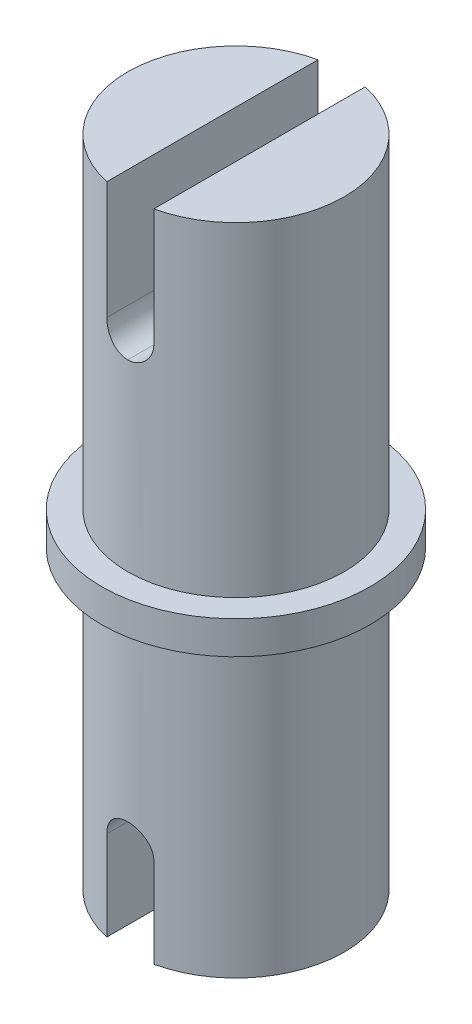
ISO-10303-21;
HEADER;
FILE_DESCRIPTION(('STEP AP214'),'2;1');
FILE_NAME('part.step','',(''),(''),'','','');
FILE_SCHEMA(('AUTOMOTIVE_DESIGN { 1 0 10303 214 1 1 1 1 }'));
ENDSEC;
DATA;
#1=APPLICATION_CONTEXT('core data for automotive mechanical design processes');
#2=APPLICATION_PROTOCOL_DEFINITION('international standard','automotive_design',2000,#1);
#3=PRODUCT_CONTEXT('',#1,'mechanical');
#4=PRODUCT('Part','Part','',(#3));
#5=PRODUCT_RELATED_PRODUCT_CATEGORY('part','',(#4));
#6=PRODUCT_DEFINITION_FORMATION('','',#4);
#7=PRODUCT_DEFINITION_CONTEXT('part definition',#1,'design');
#8=PRODUCT_DEFINITION('design','',#6,#7);
#9=PRODUCT_DEFINITION_SHAPE('','',#8);
#10=(LENGTH_UNIT() NAMED_UNIT(*) SI_UNIT(.MILLI.,.METRE.));
#11=(NAMED_UNIT(*) PLANE_ANGLE_UNIT() SI_UNIT($,.RADIAN.));
#12=(NAMED_UNIT(*) SI_UNIT($,.STERADIAN.) SOLID_ANGLE_UNIT());
#13=UNCERTAINTY_MEASURE_WITH_UNIT(LENGTH_MEASURE(1.E-05),#10,'distance_accuracy_value','');
#14=(GEOMETRIC_REPRESENTATION_CONTEXT(3) GLOBAL_UNCERTAINTY_ASSIGNED_CONTEXT((#13)) GLOBAL_UNIT_ASSIGNED_CONTEXT((#10,
#11,#12)) REPRESENTATION_CONTEXT('',''));
#15=CARTESIAN_POINT('',(0.,0.,0.));
#16=DIRECTION('',(0.,0.,1.));
#17=DIRECTION('',(1.,0.,0.));
#18=AXIS2_PLACEMENT_3D('',#15,#16,#17);
#19=CARTESIAN_POINT('',(0.,-7.25,0.));
#20=DIRECTION('',(0.,1.,0.));
#21=DIRECTION('',(0.,0.,1.));
#22=AXIS2_PLACEMENT_3D('',#19,#20,#21);
#23=CYLINDRICAL_SURFACE('',#22,2.3);
#24=CARTESIAN_POINT('',(0.,-0.35,0.));
#25=DIRECTION('',(0.,1.,0.));
#26=DIRECTION('',(0.,0.,1.));
#27=AXIS2_PLACEMENT_3D('',#24,#25,#26);
#28=CIRCLE('',#27,2.3);
#29=CARTESIAN_POINT('',(0.,-0.35,2.3));
#30=VERTEX_POINT('',#29);
#31=EDGE_CURVE('E140',#30,#30,#28,.T.);
#32=ORIENTED_EDGE('',*,*,#31,.F.);
#33=EDGE_LOOP('',(#32));
#34=FACE_BOUND('',#33,.T.);
#35=DIRECTION('',(0.,-1.,0.));
#36=VECTOR('',#35,1.);
#37=CARTESIAN_POINT('',(-0.5,-4.25,-2.24499443206436));
#38=LINE('',#37,#36);
#39=CARTESIAN_POINT('',(-0.5,-4.75,-2.24499443206436));
#40=VERTEX_POINT('',#39);
#41=CARTESIAN_POINT('',(-0.5,-6.65,-2.24499443206436));
#42=VERTEX_POINT('',#41);
#43=EDGE_CURVE('E145',#40,#42,#38,.T.);
#44=ORIENTED_EDGE('',*,*,#43,.T.);
#45=CARTESIAN_POINT('',(0.,-6.65,0.));
#46=DIRECTION('',(0.,-1.,0.));
#47=DIRECTION('',(0.,0.,-1.));
#48=AXIS2_PLACEMENT_3D('',#45,#46,#47);
#49=CIRCLE('',#48,2.3);
#50=CARTESIAN_POINT('',(-0.5,-6.65,2.24499443206436));
#51=VERTEX_POINT('',#50);
#52=EDGE_CURVE('E54',#51,#42,#49,.T.);
#53=ORIENTED_EDGE('',*,*,#52,.F.);
#54=DIRECTION('',(0.,-1.,0.));
#55=VECTOR('',#54,1.);
#56=CARTESIAN_POINT('',(-0.5,-4.25,2.24499443206436));
#57=LINE('',#56,#55);
#58=CARTESIAN_POINT('',(-0.5,-4.75,2.24499443206436));
#59=VERTEX_POINT('',#58);
#60=EDGE_CURVE('E135',#59,#51,#57,.T.);
#61=ORIENTED_EDGE('',*,*,#60,.F.);
#62=CARTESIAN_POINT('',(-0.5,-4.75,2.24499443206436));
#63=CARTESIAN_POINT('',(-0.500025434162233,-4.72222305303217,2.24497408306893));
#64=CARTESIAN_POINT('',(-0.497687024738692,-4.69446089215485,2.24550941889498));
#65=CARTESIAN_POINT('',(-0.488479736607001,-4.63978282267411,2.24753799430391));
#66=CARTESIAN_POINT('',(-0.481618918361146,-4.61286549754483,2.24902952948661));
#67=CARTESIAN_POINT('',(-0.463562205301719,-4.56058796101343,2.25281816260483));
#68=CARTESIAN_POINT('',(-0.452366042082057,-4.5352278461326,2.25511531041592));
#69=CARTESIAN_POINT('',(-0.425975724557119,-4.48673895322332,2.26024909981346));
#70=CARTESIAN_POINT('',(-0.410780831589141,-4.46361058853334,2.26308584104908));
#71=CARTESIAN_POINT('',(-0.376556030757125,-4.41986622769239,2.26903294557316));
#72=CARTESIAN_POINT('',(-0.357472606115472,-4.39929256267381,2.27214674197236));
#73=CARTESIAN_POINT('',(-0.316125030724281,-4.36160918700152,2.27826710996973));
#74=CARTESIAN_POINT('',(-0.293860280640475,-4.34450013052156,2.28127366123016));
#75=CARTESIAN_POINT('',(-0.246494096152911,-4.31406226690147,2.286878831576));
#76=CARTESIAN_POINT('',(-0.221365013380477,-4.30077559507728,2.2894727725624));
#77=CARTESIAN_POINT('',(-0.169171075301119,-4.27863678543493,2.29391915581227));
#78=CARTESIAN_POINT('',(-0.142107637943927,-4.26978143663929,2.29577213478746));
#79=CARTESIAN_POINT('',(-0.0957449499210435,-4.25887469684972,2.29808298238152));
#80=CARTESIAN_POINT('',(-0.0767480812101151,-4.25555100071087,2.29879787685876));
#81=CARTESIAN_POINT('',(-0.0385039607806533,-4.25111271905691,2.29975808776235));
#82=CARTESIAN_POINT('',(-0.0192569501805669,-4.24999614504424,2.30000382686546));
#83=CARTESIAN_POINT('',(0.,-4.25,2.3));
#84=B_SPLINE_CURVE_WITH_KNOTS('',3,(#62,#63,#64,#65,#66,#67,#68,#69,#70,#71,#72,#73,#74,#75,#76,
#77,#78,#79,#80,#81,#82,#83),.UNSPECIFIED.,.F.,.F.,(4,2,2,2,2,2,2,2,2,2,4),(0.,
0.0832049035826664,0.166261907425857,0.249324054244074,0.332401555445738,0.416710735215395,
0.501035819100043,0.586257644798393,0.671417628232312,0.729187810584911,0.786905921365021),.UNSPECIFIED.);
#85=CARTESIAN_POINT('',(0.,-4.25,2.3));
#86=VERTEX_POINT('',#85);
#87=EDGE_CURVE('E273',#59,#86,#84,.T.);
#88=ORIENTED_EDGE('',*,*,#87,.T.);
#89=CARTESIAN_POINT('',(0.,-4.25,2.3));
#90=CARTESIAN_POINT('',(0.0277845721877239,-4.24997457738012,2.30001883244396));
#91=CARTESIAN_POINT('',(0.055554983381543,-4.25231425893165,2.29949711595045));
#92=CARTESIAN_POINT('',(0.110251384694059,-4.26152739940617,2.29751368817944));
#93=CARTESIAN_POINT('',(0.137178754225612,-4.26839299770394,2.29605360676694));
#94=CARTESIAN_POINT('',(0.189477018315621,-4.28646362340849,2.29233347450605));
#95=CARTESIAN_POINT('',(0.214847765662551,-4.29766906050825,2.29007334813289));
#96=CARTESIAN_POINT('',(0.263354227827385,-4.32408105855153,2.28500291976794));
#97=CARTESIAN_POINT('',(0.286489576137246,-4.33928827409561,2.28219252778437));
#98=CARTESIAN_POINT('',(0.330226139587319,-4.37352567400049,2.27627891054117));
#99=CARTESIAN_POINT('',(0.350787156800572,-4.39260659725985,2.27317212398092));
#100=CARTESIAN_POINT('',(0.388446106930482,-4.43394393782922,2.26704088675131));
#101=CARTESIAN_POINT('',(0.405543323368396,-4.45620101049856,2.26401645322821));
#102=CARTESIAN_POINT('',(0.435968420860736,-4.50356007471157,2.25835660013056));
#103=CARTESIAN_POINT('',(0.449252090830191,-4.52869105253414,2.25572590038234));
#104=CARTESIAN_POINT('',(0.471384691828999,-4.58088876846314,2.25120519662372));
#105=CARTESIAN_POINT('',(0.480236923464258,-4.6079540486482,2.2493146415712));
#106=CARTESIAN_POINT('',(0.491135191104431,-4.65430821831344,2.24695499004473));
#107=CARTESIAN_POINT('',(0.494455085603658,-4.67329400988068,2.24622418608655));
#108=CARTESIAN_POINT('',(0.498888470507245,-4.71151667483165,2.24524200949835));
#109=CARTESIAN_POINT('',(0.500003875475348,-4.73075331572594,2.24499022085834));
#110=CARTESIAN_POINT('',(0.5,-4.75,2.24499443206436));
#111=B_SPLINE_CURVE_WITH_KNOTS('',3,(#89,#90,#91,#92,#93,#94,#95,#96,#97,#98,#99,#100,#101,#102,
#103,#104,#105,#106,#107,#108,#109,#110),.UNSPECIFIED.,.F.,.F.,(4,2,2,2,2,2,2,2,2,2,4),(0.,
0.083228954597043,0.166313736410875,0.249406363573863,0.332512591271695,0.416787149934477,
0.501079122826125,0.5863121173926,0.671481534260578,0.72921882040634,0.786905940573443),.UNSPECIFIED.);
#112=CARTESIAN_POINT('',(0.5,-4.75,2.24499443206436));
#113=VERTEX_POINT('',#112);
#114=EDGE_CURVE('E255',#86,#113,#111,.T.);
#115=ORIENTED_EDGE('',*,*,#114,.T.);
#116=DIRECTION('',(0.,-1.,0.));
#117=VECTOR('',#116,1.);
#118=CARTESIAN_POINT('',(0.5,-4.25,2.24499443206436));
#119=LINE('',#118,#117);
#120=CARTESIAN_POINT('',(0.5,-6.65,2.24499443206436));
#121=VERTEX_POINT('',#120);
#122=EDGE_CURVE('E122',#113,#121,#119,.T.);
#123=ORIENTED_EDGE('',*,*,#122,.T.);
#124=CARTESIAN_POINT('',(0.5,-6.65,-2.24499443206436));
#125=VERTEX_POINT('',#124);
#126=EDGE_CURVE('E61',#125,#121,#49,.T.);
#127=ORIENTED_EDGE('',*,*,#126,.F.);
#128=DIRECTION('',(0.,-1.,0.));
#129=VECTOR('',#128,1.);
#130=CARTESIAN_POINT('',(0.5,-4.25,-2.24499443206436));
#131=LINE('',#130,#129);
#132=CARTESIAN_POINT('',(0.5,-4.75,-2.24499443206436));
#133=VERTEX_POINT('',#132);
#134=EDGE_CURVE('E121',#133,#125,#131,.T.);
#135=ORIENTED_EDGE('',*,*,#134,.F.);
#136=CARTESIAN_POINT('',(0.5,-4.75,-2.24499443206436));
#137=CARTESIAN_POINT('',(0.500025434162233,-4.72222305303217,-2.24497408306893));
#138=CARTESIAN_POINT('',(0.497687024738692,-4.69446089215485,-2.24550941889498));
#139=CARTESIAN_POINT('',(0.488479736607001,-4.63978282267411,-2.24753799430391));
#140=CARTESIAN_POINT('',(0.481618918361146,-4.61286549754483,-2.24902952948661));
#141=CARTESIAN_POINT('',(0.463562205301719,-4.56058796101343,-2.25281816260483));
#142=CARTESIAN_POINT('',(0.452366042082057,-4.5352278461326,-2.25511531041592));
#143=CARTESIAN_POINT('',(0.425975724557119,-4.48673895322332,-2.26024909981346));
#144=CARTESIAN_POINT('',(0.410780831589141,-4.46361058853334,-2.26308584104908));
#145=CARTESIAN_POINT('',(0.376556030757125,-4.41986622769239,-2.26903294557316));
#146=CARTESIAN_POINT('',(0.357472606115472,-4.39929256267381,-2.27214674197236));
#147=CARTESIAN_POINT('',(0.316125030724281,-4.36160918700152,-2.27826710996973));
#148=CARTESIAN_POINT('',(0.293860280640475,-4.34450013052156,-2.28127366123016));
#149=CARTESIAN_POINT('',(0.246494096152911,-4.31406226690147,-2.286878831576));
#150=CARTESIAN_POINT('',(0.221365013380477,-4.30077559507728,-2.2894727725624));
#151=CARTESIAN_POINT('',(0.169171075301119,-4.27863678543493,-2.29391915581227));
#152=CARTESIAN_POINT('',(0.142107637943927,-4.26978143663929,-2.29577213478746));
#153=CARTESIAN_POINT('',(0.0957449499210435,-4.25887469684972,-2.29808298238152));
#154=CARTESIAN_POINT('',(0.0767480812101151,-4.25555100071087,-2.29879787685876));
#155=CARTESIAN_POINT('',(0.0385039607806533,-4.25111271905691,-2.29975808776235));
#156=CARTESIAN_POINT('',(0.0192569501805669,-4.24999614504424,-2.30000382686546));
#157=CARTESIAN_POINT('',(0.,-4.25,-2.3));
#158=B_SPLINE_CURVE_WITH_KNOTS('',3,(#136,#137,#138,#139,#140,#141,#142,#143,#144,#145,#146,
#147,#148,#149,#150,#151,#152,#153,#154,#155,#156,#157),.UNSPECIFIED.,.F.,.F.,(4,2,2,2,2,2,2,2,
2,2,4),(0.,0.0832049035826664,0.166261907425857,0.249324054244074,0.332401555445738,
0.416710735215395,0.501035819100043,0.586257644798393,0.671417628232312,0.729187810584911,
0.786905921365021),.UNSPECIFIED.);
#159=CARTESIAN_POINT('',(0.,-4.25,-2.3));
#160=VERTEX_POINT('',#159);
#161=EDGE_CURVE('E247',#133,#160,#158,.T.);
#162=ORIENTED_EDGE('',*,*,#161,.T.);
#163=CARTESIAN_POINT('',(0.,-4.25,-2.3));
#164=CARTESIAN_POINT('',(-0.027784572187724,-4.24997457738012,-2.30001883244396));
#165=CARTESIAN_POINT('',(-0.0555549833815431,-4.25231425893165,-2.29949711595045));
#166=CARTESIAN_POINT('',(-0.110251384694059,-4.26152739940617,-2.29751368817944));
#167=CARTESIAN_POINT('',(-0.137178754225612,-4.26839299770394,-2.29605360676694));
#168=CARTESIAN_POINT('',(-0.189477018315621,-4.28646362340849,-2.29233347450605));
#169=CARTESIAN_POINT('',(-0.214847765662551,-4.29766906050825,-2.29007334813289));
#170=CARTESIAN_POINT('',(-0.263354227827385,-4.32408105855153,-2.28500291976794));
#171=CARTESIAN_POINT('',(-0.286489576137246,-4.33928827409561,-2.28219252778437));
#172=CARTESIAN_POINT('',(-0.33022613958732,-4.37352567400049,-2.27627891054117));
#173=CARTESIAN_POINT('',(-0.350787156800573,-4.39260659725985,-2.27317212398092));
#174=CARTESIAN_POINT('',(-0.388446106930482,-4.43394393782922,-2.26704088675131));
#175=CARTESIAN_POINT('',(-0.405543323368397,-4.45620101049856,-2.26401645322821));
#176=CARTESIAN_POINT('',(-0.435968420860736,-4.50356007471157,-2.25835660013056));
#177=CARTESIAN_POINT('',(-0.449252090830191,-4.52869105253414,-2.25572590038234));
#178=CARTESIAN_POINT('',(-0.471384691829,-4.58088876846314,-2.25120519662372));
#179=CARTESIAN_POINT('',(-0.480236923464258,-4.6079540486482,-2.2493146415712));
#180=CARTESIAN_POINT('',(-0.491135191104431,-4.65430821831344,-2.24695499004473));
#181=CARTESIAN_POINT('',(-0.494455085603658,-4.67329400988068,-2.24622418608655));
#182=CARTESIAN_POINT('',(-0.498888470507245,-4.71151667483165,-2.24524200949835));
#183=CARTESIAN_POINT('',(-0.500003875475348,-4.73075331572594,-2.24499022085834));
#184=CARTESIAN_POINT('',(-0.5,-4.75,-2.24499443206437));
#185=B_SPLINE_CURVE_WITH_KNOTS('',3,(#163,#164,#165,#166,#167,#168,#169,#170,#171,#172,#173,
#174,#175,#176,#177,#178,#179,#180,#181,#182,#183,#184),.UNSPECIFIED.,.F.,.F.,(4,2,2,2,2,2,2,2,
2,2,4),(0.,0.083228954597043,0.166313736410875,0.249406363573863,0.332512591271695,
0.416787149934477,0.501079122826126,0.5863121173926,0.671481534260578,0.72921882040634,
0.786905940573443),.UNSPECIFIED.);
#186=EDGE_CURVE('E48',#160,#40,#185,.T.);
#187=ORIENTED_EDGE('',*,*,#186,.T.);
#188=EDGE_LOOP('',(#44,#53,#61,#88,#115,#123,#127,#135,#162,#187));
#189=FACE_BOUND('',#188,.T.);
#190=ADVANCED_FACE('F38',(#34,#189),#23,.T.);
#191=CARTESIAN_POINT('',(-0.5,-4.25,-2.24499443206436));
#192=DIRECTION('',(1.,0.,0.));
#193=DIRECTION('',(0.,0.,-1.));
#194=AXIS2_PLACEMENT_3D('',#191,#192,#193);
#195=PLANE('',#194);
#196=ORIENTED_EDGE('',*,*,#60,.T.);
#197=DIRECTION('',(0.,0.,-1.));
#198=VECTOR('',#197,1.);
#199=CARTESIAN_POINT('',(-0.5,-6.65,-2.24499443206436));
#200=LINE('',#199,#198);
#201=EDGE_CURVE('E124',#51,#42,#200,.T.);
#202=ORIENTED_EDGE('',*,*,#201,.T.);
#203=ORIENTED_EDGE('',*,*,#43,.F.);
#204=DIRECTION('',(0.,0.,1.));
#205=VECTOR('',#204,1.);
#206=CARTESIAN_POINT('',(-0.5,-4.75,-2.24499443206436));
#207=LINE('',#206,#205);
#208=EDGE_CURVE('E244',#40,#59,#207,.T.);
#209=ORIENTED_EDGE('',*,*,#208,.T.);
#210=EDGE_LOOP('',(#196,#202,#203,#209));
#211=FACE_BOUND('',#210,.T.);
#212=ADVANCED_FACE('F265',(#211),#195,.T.);
#213=CARTESIAN_POINT('',(0.5,-4.25,-2.24499443206436));
#214=DIRECTION('',(-1.,0.,0.));
#215=DIRECTION('',(0.,0.,1.));
#216=AXIS2_PLACEMENT_3D('',#213,#214,#215);
#217=PLANE('',#216);
#218=ORIENTED_EDGE('',*,*,#134,.T.);
#219=DIRECTION('',(0.,0.,1.));
#220=VECTOR('',#219,1.);
#221=CARTESIAN_POINT('',(0.5,-6.65,-2.24499443206436));
#222=LINE('',#221,#220);
#223=EDGE_CURVE('E11',#125,#121,#222,.T.);
#224=ORIENTED_EDGE('',*,*,#223,.T.);
#225=ORIENTED_EDGE('',*,*,#122,.F.);
#226=DIRECTION('',(0.,0.,-1.));
#227=VECTOR('',#226,1.);
#228=CARTESIAN_POINT('',(0.5,-4.75,-2.24499443206436));
#229=LINE('',#228,#227);
#230=EDGE_CURVE('E129',#113,#133,#229,.T.);
#231=ORIENTED_EDGE('',*,*,#230,.T.);
#232=EDGE_LOOP('',(#218,#224,#225,#231));
#233=FACE_BOUND('',#232,.T.);
#234=ADVANCED_FACE('F127',(#233),#217,.T.);
#235=CARTESIAN_POINT('',(0.,7.25,0.));
#236=DIRECTION('',(0.,1.,0.));
#237=DIRECTION('',(0.,0.,1.));
#238=AXIS2_PLACEMENT_3D('',#235,#236,#237);
#239=PLANE('',#238);
#240=DIRECTION('',(0.,0.,-1.));
#241=VECTOR('',#240,1.);
#242=CARTESIAN_POINT('',(0.5,7.25,-2.24499443206436));
#243=LINE('',#242,#241);
#244=CARTESIAN_POINT('',(0.5,7.25,2.24499443206436));
#245=VERTEX_POINT('',#244);
#246=CARTESIAN_POINT('',(0.5,7.25,-2.24499443206436));
#247=VERTEX_POINT('',#246);
#248=EDGE_CURVE('E154',#245,#247,#243,.T.);
#249=ORIENTED_EDGE('',*,*,#248,.F.);
#250=CARTESIAN_POINT('',(0.,7.25,0.));
#251=DIRECTION('',(0.,1.,0.));
#252=DIRECTION('',(0.,0.,1.));
#253=AXIS2_PLACEMENT_3D('',#250,#251,#252);
#254=CIRCLE('',#253,2.3);
#255=EDGE_CURVE('E171',#245,#247,#254,.T.);
#256=ORIENTED_EDGE('',*,*,#255,.T.);
#257=EDGE_LOOP('',(#249,#256));
#258=FACE_BOUND('',#257,.T.);
#259=ADVANCED_FACE('F324',(#258),#239,.T.);
#260=CARTESIAN_POINT('',(0.,0.35,0.));
#261=DIRECTION('',(0.,-1.,0.));
#262=DIRECTION('',(0.,0.,-1.));
#263=AXIS2_PLACEMENT_3D('',#260,#261,#262);
#264=CYLINDRICAL_SURFACE('',#263,2.85);
#265=CARTESIAN_POINT('',(0.,0.35,0.));
#266=DIRECTION('',(0.,1.,0.));
#267=DIRECTION('',(0.,0.,1.));
#268=AXIS2_PLACEMENT_3D('',#265,#266,#267);
#269=CIRCLE('',#268,2.85);
#270=CARTESIAN_POINT('',(0.,0.35,2.85));
#271=VERTEX_POINT('',#270);
#272=EDGE_CURVE('E175',#271,#271,#269,.T.);
#273=ORIENTED_EDGE('',*,*,#272,.F.);
#274=EDGE_LOOP('',(#273));
#275=FACE_BOUND('',#274,.T.);
#276=CARTESIAN_POINT('',(0.,-0.35,0.));
#277=DIRECTION('',(0.,1.,0.));
#278=DIRECTION('',(0.,0.,1.));
#279=AXIS2_PLACEMENT_3D('',#276,#277,#278);
#280=CIRCLE('',#279,2.85);
#281=CARTESIAN_POINT('',(0.,-0.35,2.85));
#282=VERTEX_POINT('',#281);
#283=EDGE_CURVE('E144',#282,#282,#280,.T.);
#284=ORIENTED_EDGE('',*,*,#283,.T.);
#285=EDGE_LOOP('',(#284));
#286=FACE_BOUND('',#285,.T.);
#287=ADVANCED_FACE('F217',(#275,#286),#264,.T.);
#288=CARTESIAN_POINT('',(0.,0.35,0.));
#289=DIRECTION('',(0.,1.,0.));
#290=DIRECTION('',(0.,0.,1.));
#291=AXIS2_PLACEMENT_3D('',#288,#289,#290);
#292=PLANE('',#291);
#293=CARTESIAN_POINT('',(0.,0.35,0.));
#294=DIRECTION('',(0.,1.,0.));
#295=DIRECTION('',(0.,0.,1.));
#296=AXIS2_PLACEMENT_3D('',#293,#294,#295);
#297=CIRCLE('',#296,2.3);
#298=CARTESIAN_POINT('',(0.,0.35,2.3));
#299=VERTEX_POINT('',#298);
#300=EDGE_CURVE('E176',#299,#299,#297,.T.);
#301=ORIENTED_EDGE('',*,*,#300,.F.);
#302=EDGE_LOOP('',(#301));
#303=FACE_BOUND('',#302,.T.);
#304=ORIENTED_EDGE('',*,*,#272,.T.);
#305=EDGE_LOOP('',(#304));
#306=FACE_BOUND('',#305,.T.);
#307=ADVANCED_FACE('F330',(#303,#306),#292,.T.);
#308=CARTESIAN_POINT('',(0.,7.25,0.));
#309=DIRECTION('',(0.,-1.,0.));
#310=DIRECTION('',(0.,0.,-1.));
#311=AXIS2_PLACEMENT_3D('',#308,#309,#310);
#312=CYLINDRICAL_SURFACE('',#311,2.3);
#313=ORIENTED_EDGE('',*,*,#255,.F.);
#314=DIRECTION('',(0.,1.,0.));
#315=VECTOR('',#314,1.);
#316=CARTESIAN_POINT('',(0.5,4.25,2.24499443206436));
#317=LINE('',#316,#315);
#318=CARTESIAN_POINT('',(0.5,4.75,2.24499443206436));
#319=VERTEX_POINT('',#318);
#320=EDGE_CURVE('E163',#319,#245,#317,.T.);
#321=ORIENTED_EDGE('',*,*,#320,.F.);
#322=CARTESIAN_POINT('',(0.5,4.75,2.24499443206436));
#323=CARTESIAN_POINT('',(0.500025434162233,4.72222305303217,2.24497408306893));
#324=CARTESIAN_POINT('',(0.497687024738692,4.69446089215485,2.24550941889498));
#325=CARTESIAN_POINT('',(0.488479736607002,4.63978282267411,2.24753799430391));
#326=CARTESIAN_POINT('',(0.481618918361146,4.61286549754483,2.24902952948661));
#327=CARTESIAN_POINT('',(0.463562205301719,4.56058796101343,2.25281816260483));
#328=CARTESIAN_POINT('',(0.452366042082057,4.5352278461326,2.25511531041592));
#329=CARTESIAN_POINT('',(0.425975724557119,4.48673895322332,2.26024909981346));
#330=CARTESIAN_POINT('',(0.410780831589141,4.46361058853334,2.26308584104908));
#331=CARTESIAN_POINT('',(0.376556030757125,4.41986622769239,2.26903294557316));
#332=CARTESIAN_POINT('',(0.357472606115472,4.39929256267381,2.27214674197236));
#333=CARTESIAN_POINT('',(0.316125030724281,4.36160918700152,2.27826710996973));
#334=CARTESIAN_POINT('',(0.293860280640475,4.34450013052156,2.28127366123016));
#335=CARTESIAN_POINT('',(0.246494096152912,4.31406226690147,2.286878831576));
#336=CARTESIAN_POINT('',(0.221365013380477,4.30077559507728,2.2894727725624));
#337=CARTESIAN_POINT('',(0.16917107530112,4.27863678543493,2.29391915581227));
#338=CARTESIAN_POINT('',(0.142107637943927,4.26978143663929,2.29577213478746));
#339=CARTESIAN_POINT('',(0.0957449499210439,4.25887469684972,2.29808298238152));
#340=CARTESIAN_POINT('',(0.0767480812101155,4.25555100071087,2.29879787685876));
#341=CARTESIAN_POINT('',(0.0385039607806537,4.25111271905691,2.29975808776235));
#342=CARTESIAN_POINT('',(0.0192569501805674,4.24999614504424,2.30000382686546));
#343=CARTESIAN_POINT('',(0.,4.25,2.3));
#344=B_SPLINE_CURVE_WITH_KNOTS('',3,(#322,#323,#324,#325,#326,#327,#328,#329,#330,#331,#332,
#333,#334,#335,#336,#337,#338,#339,#340,#341,#342,#343),.UNSPECIFIED.,.F.,.F.,(4,2,2,2,2,2,2,2,
2,2,4),(0.,0.0832049035826664,0.166261907425857,0.249324054244074,0.332401555445738,
0.416710735215395,0.501035819100043,0.586257644798393,0.671417628232312,0.729187810584911,
0.786905921365021),.UNSPECIFIED.);
#345=CARTESIAN_POINT('',(0.,4.25,2.3));
#346=VERTEX_POINT('',#345);
#347=EDGE_CURVE('E199',#319,#346,#344,.T.);
#348=ORIENTED_EDGE('',*,*,#347,.T.);
#349=CARTESIAN_POINT('',(0.,4.25,2.3));
#350=CARTESIAN_POINT('',(-0.0277845721877243,4.24997457738012,2.30001883244396));
#351=CARTESIAN_POINT('',(-0.0555549833815435,4.25231425893165,2.29949711595045));
#352=CARTESIAN_POINT('',(-0.11025138469406,4.26152739940617,2.29751368817944));
#353=CARTESIAN_POINT('',(-0.137178754225613,4.26839299770394,2.29605360676694));
#354=CARTESIAN_POINT('',(-0.189477018315621,4.28646362340849,2.29233347450605));
#355=CARTESIAN_POINT('',(-0.214847765662551,4.29766906050825,2.29007334813289));
#356=CARTESIAN_POINT('',(-0.263354227827385,4.32408105855153,2.28500291976794));
#357=CARTESIAN_POINT('',(-0.286489576137246,4.33928827409561,2.28219252778437));
#358=CARTESIAN_POINT('',(-0.33022613958732,4.37352567400049,2.27627891054117));
#359=CARTESIAN_POINT('',(-0.350787156800573,4.39260659725985,2.27317212398092));
#360=CARTESIAN_POINT('',(-0.388446106930482,4.43394393782922,2.26704088675131));
#361=CARTESIAN_POINT('',(-0.405543323368397,4.45620101049856,2.26401645322821));
#362=CARTESIAN_POINT('',(-0.435968420860736,4.50356007471157,2.25835660013056));
#363=CARTESIAN_POINT('',(-0.449252090830191,4.52869105253414,2.25572590038234));
#364=CARTESIAN_POINT('',(-0.471384691829,4.58088876846314,2.25120519662372));
#365=CARTESIAN_POINT('',(-0.480236923464258,4.6079540486482,2.2493146415712));
#366=CARTESIAN_POINT('',(-0.491135191104431,4.65430821831344,2.24695499004473));
#367=CARTESIAN_POINT('',(-0.494455085603658,4.67329400988068,2.24622418608655));
#368=CARTESIAN_POINT('',(-0.498888470507245,4.71151667483165,2.24524200949835));
#369=CARTESIAN_POINT('',(-0.500003875475349,4.73075331572594,2.24499022085834));
#370=CARTESIAN_POINT('',(-0.5,4.75,2.24499443206436));
#371=B_SPLINE_CURVE_WITH_KNOTS('',3,(#349,#350,#351,#352,#353,#354,#355,#356,#357,#358,#359,
#360,#361,#362,#363,#364,#365,#366,#367,#368,#369,#370),.UNSPECIFIED.,.F.,.F.,(4,2,2,2,2,2,2,2,
2,2,4),(0.,0.083228954597043,0.166313736410875,0.249406363573863,0.332512591271695,
0.416787149934477,0.501079122826125,0.5863121173926,0.671481534260578,0.72921882040634,
0.786905940573443),.UNSPECIFIED.);
#372=CARTESIAN_POINT('',(-0.5,4.75,2.24499443206436));
#373=VERTEX_POINT('',#372);
#374=EDGE_CURVE('E226',#346,#373,#371,.T.);
#375=ORIENTED_EDGE('',*,*,#374,.T.);
#376=DIRECTION('',(0.,1.,0.));
#377=VECTOR('',#376,1.);
#378=CARTESIAN_POINT('',(-0.5,4.25,2.24499443206436));
#379=LINE('',#378,#377);
#380=CARTESIAN_POINT('',(-0.5,7.25,2.24499443206436));
#381=VERTEX_POINT('',#380);
#382=EDGE_CURVE('E166',#373,#381,#379,.T.);
#383=ORIENTED_EDGE('',*,*,#382,.T.);
#384=CARTESIAN_POINT('',(-0.5,7.25,-2.24499443206436));
#385=VERTEX_POINT('',#384);
#386=EDGE_CURVE('E162',#385,#381,#254,.T.);
#387=ORIENTED_EDGE('',*,*,#386,.F.);
#388=DIRECTION('',(0.,1.,0.));
#389=VECTOR('',#388,1.);
#390=CARTESIAN_POINT('',(-0.5,4.25,-2.24499443206436));
#391=LINE('',#390,#389);
#392=CARTESIAN_POINT('',(-0.5,4.75,-2.24499443206436));
#393=VERTEX_POINT('',#392);
#394=EDGE_CURVE('E158',#393,#385,#391,.T.);
#395=ORIENTED_EDGE('',*,*,#394,.F.);
#396=CARTESIAN_POINT('',(-0.5,4.75,-2.24499443206436));
#397=CARTESIAN_POINT('',(-0.500025434162233,4.72222305303217,-2.24497408306893));
#398=CARTESIAN_POINT('',(-0.497687024738692,4.69446089215485,-2.24550941889498));
#399=CARTESIAN_POINT('',(-0.488479736607002,4.63978282267411,-2.24753799430391));
#400=CARTESIAN_POINT('',(-0.481618918361146,4.61286549754483,-2.24902952948661));
#401=CARTESIAN_POINT('',(-0.463562205301719,4.56058796101343,-2.25281816260483));
#402=CARTESIAN_POINT('',(-0.452366042082056,4.5352278461326,-2.25511531041592));
#403=CARTESIAN_POINT('',(-0.425975724557119,4.48673895322331,-2.26024909981346));
#404=CARTESIAN_POINT('',(-0.410780831589141,4.46361058853334,-2.26308584104908));
#405=CARTESIAN_POINT('',(-0.376556030757126,4.41986622769239,-2.26903294557316));
#406=CARTESIAN_POINT('',(-0.357472606115473,4.39929256267381,-2.27214674197236));
#407=CARTESIAN_POINT('',(-0.316125030724281,4.36160918700152,-2.27826710996973));
#408=CARTESIAN_POINT('',(-0.293860280640475,4.34450013052156,-2.28127366123016));
#409=CARTESIAN_POINT('',(-0.246494096152912,4.31406226690147,-2.286878831576));
#410=CARTESIAN_POINT('',(-0.221365013380477,4.30077559507728,-2.2894727725624));
#411=CARTESIAN_POINT('',(-0.16917107530112,4.27863678543493,-2.29391915581227));
#412=CARTESIAN_POINT('',(-0.142107637943927,4.26978143663929,-2.29577213478746));
#413=CARTESIAN_POINT('',(-0.0957449499210439,4.25887469684972,-2.29808298238152));
#414=CARTESIAN_POINT('',(-0.0767480812101156,4.25555100071087,-2.29879787685876));
#415=CARTESIAN_POINT('',(-0.0385039607806538,4.25111271905691,-2.29975808776235));
#416=CARTESIAN_POINT('',(-0.0192569501805674,4.24999614504424,-2.30000382686546));
#417=CARTESIAN_POINT('',(0.,4.25,-2.3));
#418=B_SPLINE_CURVE_WITH_KNOTS('',3,(#396,#397,#398,#399,#400,#401,#402,#403,#404,#405,#406,
#407,#408,#409,#410,#411,#412,#413,#414,#415,#416,#417),.UNSPECIFIED.,.F.,.F.,(4,2,2,2,2,2,2,2,
2,2,4),(0.,0.0832049035826664,0.166261907425857,0.249324054244075,0.332401555445738,
0.416710735215395,0.501035819100043,0.586257644798393,0.671417628232312,0.729187810584911,
0.786905921365021),.UNSPECIFIED.);
#419=CARTESIAN_POINT('',(0.,4.25,-2.3));
#420=VERTEX_POINT('',#419);
#421=EDGE_CURVE('E232',#393,#420,#418,.T.);
#422=ORIENTED_EDGE('',*,*,#421,.T.);
#423=CARTESIAN_POINT('',(0.,4.25,-2.3));
#424=CARTESIAN_POINT('',(0.0277845721877244,4.24997457738012,-2.30001883244396));
#425=CARTESIAN_POINT('',(0.0555549833815435,4.25231425893165,-2.29949711595045));
#426=CARTESIAN_POINT('',(0.11025138469406,4.26152739940617,-2.29751368817944));
#427=CARTESIAN_POINT('',(0.137178754225613,4.26839299770394,-2.29605360676694));
#428=CARTESIAN_POINT('',(0.189477018315621,4.28646362340849,-2.29233347450605));
#429=CARTESIAN_POINT('',(0.214847765662551,4.29766906050825,-2.29007334813289));
#430=CARTESIAN_POINT('',(0.263354227827385,4.32408105855153,-2.28500291976794));
#431=CARTESIAN_POINT('',(0.286489576137246,4.33928827409561,-2.28219252778437));
#432=CARTESIAN_POINT('',(0.33022613958732,4.37352567400049,-2.27627891054117));
#433=CARTESIAN_POINT('',(0.350787156800573,4.39260659725985,-2.27317212398092));
#434=CARTESIAN_POINT('',(0.388446106930483,4.43394393782922,-2.26704088675131));
#435=CARTESIAN_POINT('',(0.405543323368397,4.45620101049856,-2.26401645322821));
#436=CARTESIAN_POINT('',(0.435968420860737,4.50356007471157,-2.25835660013056));
#437=CARTESIAN_POINT('',(0.449252090830191,4.52869105253414,-2.25572590038234));
#438=CARTESIAN_POINT('',(0.471384691829,4.58088876846314,-2.25120519662372));
#439=CARTESIAN_POINT('',(0.480236923464258,4.6079540486482,-2.2493146415712));
#440=CARTESIAN_POINT('',(0.491135191104431,4.65430821831344,-2.24695499004473));
#441=CARTESIAN_POINT('',(0.494455085603658,4.67329400988068,-2.24622418608655));
#442=CARTESIAN_POINT('',(0.498888470507245,4.71151667483165,-2.24524200949835));
#443=CARTESIAN_POINT('',(0.500003875475349,4.73075331572594,-2.24499022085834));
#444=CARTESIAN_POINT('',(0.5,4.75,-2.24499443206436));
#445=B_SPLINE_CURVE_WITH_KNOTS('',3,(#423,#424,#425,#426,#427,#428,#429,#430,#431,#432,#433,
#434,#435,#436,#437,#438,#439,#440,#441,#442,#443,#444),.UNSPECIFIED.,.F.,.F.,(4,2,2,2,2,2,2,2,
2,2,4),(0.,0.083228954597043,0.166313736410875,0.249406363573863,0.332512591271695,
0.416787149934478,0.501079122826126,0.5863121173926,0.671481534260577,0.72921882040634,
0.786905940573443),.UNSPECIFIED.);
#446=CARTESIAN_POINT('',(0.5,4.75,-2.24499443206436));
#447=VERTEX_POINT('',#446);
#448=EDGE_CURVE('E190',#420,#447,#445,.T.);
#449=ORIENTED_EDGE('',*,*,#448,.T.);
#450=DIRECTION('',(0.,1.,0.));
#451=VECTOR('',#450,1.);
#452=CARTESIAN_POINT('',(0.5,4.25,-2.24499443206436));
#453=LINE('',#452,#451);
#454=EDGE_CURVE('E159',#447,#247,#453,.T.);
#455=ORIENTED_EDGE('',*,*,#454,.T.);
#456=EDGE_LOOP('',(#313,#321,#348,#375,#383,#387,#395,#422,#449,#455));
#457=FACE_BOUND('',#456,.T.);
#458=ORIENTED_EDGE('',*,*,#300,.T.);
#459=EDGE_LOOP('',(#458));
#460=FACE_BOUND('',#459,.T.);
#461=ADVANCED_FACE('F205',(#457,#460),#312,.T.);
#462=DIRECTION('',(0.,0.,1.));
#463=VECTOR('',#462,1.);
#464=CARTESIAN_POINT('',(-0.5,7.25,-2.24499443206436));
#465=LINE('',#464,#463);
#466=EDGE_CURVE('E150',#385,#381,#465,.T.);
#467=ORIENTED_EDGE('',*,*,#466,.F.);
#468=ORIENTED_EDGE('',*,*,#386,.T.);
#469=EDGE_LOOP('',(#467,#468));
#470=FACE_BOUND('',#469,.T.);
#471=ADVANCED_FACE('F321',(#470),#239,.T.);
#472=CARTESIAN_POINT('',(0.5,4.25,-2.24499443206436));
#473=DIRECTION('',(1.,0.,0.));
#474=DIRECTION('',(0.,0.,-1.));
#475=AXIS2_PLACEMENT_3D('',#472,#473,#474);
#476=PLANE('',#475);
#477=ORIENTED_EDGE('',*,*,#454,.F.);
#478=DIRECTION('',(0.,0.,-1.));
#479=VECTOR('',#478,1.);
#480=CARTESIAN_POINT('',(0.5,4.75,2.24499443206436));
#481=LINE('',#480,#479);
#482=EDGE_CURVE('E180',#447,#319,#481,.F.);
#483=ORIENTED_EDGE('',*,*,#482,.T.);
#484=ORIENTED_EDGE('',*,*,#320,.T.);
#485=ORIENTED_EDGE('',*,*,#248,.T.);
#486=EDGE_LOOP('',(#477,#483,#484,#485));
#487=FACE_BOUND('',#486,.T.);
#488=ADVANCED_FACE('F323',(#487),#476,.F.);
#489=CARTESIAN_POINT('',(-0.5,4.25,-2.24499443206436));
#490=DIRECTION('',(-1.,0.,0.));
#491=DIRECTION('',(0.,0.,1.));
#492=AXIS2_PLACEMENT_3D('',#489,#490,#491);
#493=PLANE('',#492);
#494=ORIENTED_EDGE('',*,*,#382,.F.);
#495=DIRECTION('',(0.,0.,1.));
#496=VECTOR('',#495,1.);
#497=CARTESIAN_POINT('',(-0.5,4.75,-2.24499443206436));
#498=LINE('',#497,#496);
#499=EDGE_CURVE('E187',#373,#393,#498,.F.);
#500=ORIENTED_EDGE('',*,*,#499,.T.);
#501=ORIENTED_EDGE('',*,*,#394,.T.);
#502=ORIENTED_EDGE('',*,*,#466,.T.);
#503=EDGE_LOOP('',(#494,#500,#501,#502));
#504=FACE_BOUND('',#503,.T.);
#505=ADVANCED_FACE('F221',(#504),#493,.F.);
#506=CARTESIAN_POINT('',(0.,4.75,0.));
#507=DIRECTION('',(0.,0.,-1.));
#508=DIRECTION('',(-1.,0.,0.));
#509=AXIS2_PLACEMENT_3D('',#506,#507,#508);
#510=CYLINDRICAL_SURFACE('',#509,0.5);
#511=ORIENTED_EDGE('',*,*,#499,.F.);
#512=ORIENTED_EDGE('',*,*,#374,.F.);
#513=DIRECTION('',(0.,0.,1.));
#514=VECTOR('',#513,1.);
#515=CARTESIAN_POINT('',(0.,4.25,2.24499443206436));
#516=LINE('',#515,#514);
#517=EDGE_CURVE('E149',#420,#346,#516,.T.);
#518=ORIENTED_EDGE('',*,*,#517,.F.);
#519=ORIENTED_EDGE('',*,*,#421,.F.);
#520=EDGE_LOOP('',(#511,#512,#518,#519));
#521=FACE_BOUND('',#520,.T.);
#522=ADVANCED_FACE('F215',(#521),#510,.F.);
#523=CARTESIAN_POINT('',(0.,4.75,0.));
#524=DIRECTION('',(0.,0.,1.));
#525=DIRECTION('',(1.,0.,0.));
#526=AXIS2_PLACEMENT_3D('',#523,#524,#525);
#527=CYLINDRICAL_SURFACE('',#526,0.5);
#528=ORIENTED_EDGE('',*,*,#347,.F.);
#529=ORIENTED_EDGE('',*,*,#482,.F.);
#530=ORIENTED_EDGE('',*,*,#448,.F.);
#531=ORIENTED_EDGE('',*,*,#517,.T.);
#532=EDGE_LOOP('',(#528,#529,#530,#531));
#533=FACE_BOUND('',#532,.T.);
#534=ADVANCED_FACE('F209',(#533),#527,.F.);
#535=CARTESIAN_POINT('',(0.,-0.35,0.));
#536=DIRECTION('',(0.,-1.,0.));
#537=DIRECTION('',(0.,0.,1.));
#538=AXIS2_PLACEMENT_3D('',#535,#536,#537);
#539=PLANE('',#538);
#540=ORIENTED_EDGE('',*,*,#31,.T.);
#541=EDGE_LOOP('',(#540));
#542=FACE_BOUND('',#541,.T.);
#543=ORIENTED_EDGE('',*,*,#283,.F.);
#544=EDGE_LOOP('',(#543));
#545=FACE_BOUND('',#544,.T.);
#546=ADVANCED_FACE('F214',(#542,#545),#539,.T.);
#547=CARTESIAN_POINT('',(0.,-4.75,-2.24499443206436));
#548=DIRECTION('',(0.,0.,1.));
#549=DIRECTION('',(1.,0.,0.));
#550=AXIS2_PLACEMENT_3D('',#547,#548,#549);
#551=CYLINDRICAL_SURFACE('',#550,0.5);
#552=DIRECTION('',(0.,0.,1.));
#553=VECTOR('',#552,1.);
#554=CARTESIAN_POINT('',(0.,-4.25,0.));
#555=LINE('',#554,#553);
#556=EDGE_CURVE('E131',#86,#160,#555,.F.);
#557=ORIENTED_EDGE('',*,*,#556,.F.);
#558=ORIENTED_EDGE('',*,*,#87,.F.);
#559=ORIENTED_EDGE('',*,*,#208,.F.);
#560=ORIENTED_EDGE('',*,*,#186,.F.);
#561=EDGE_LOOP('',(#557,#558,#559,#560));
#562=FACE_BOUND('',#561,.T.);
#563=ADVANCED_FACE('F40',(#562),#551,.F.);
#564=CARTESIAN_POINT('',(0.,-4.75,-2.24499443206436));
#565=DIRECTION('',(0.,0.,-1.));
#566=DIRECTION('',(-1.,0.,0.));
#567=AXIS2_PLACEMENT_3D('',#564,#565,#566);
#568=CYLINDRICAL_SURFACE('',#567,0.5);
#569=ORIENTED_EDGE('',*,*,#114,.F.);
#570=ORIENTED_EDGE('',*,*,#556,.T.);
#571=ORIENTED_EDGE('',*,*,#161,.F.);
#572=ORIENTED_EDGE('',*,*,#230,.F.);
#573=EDGE_LOOP('',(#569,#570,#571,#572));
#574=FACE_BOUND('',#573,.T.);
#575=ADVANCED_FACE('F223',(#574),#568,.F.);
#576=CARTESIAN_POINT('',(0.,-6.65,0.));
#577=DIRECTION('',(0.,-1.,0.));
#578=DIRECTION('',(0.,0.,-1.));
#579=AXIS2_PLACEMENT_3D('',#576,#577,#578);
#580=PLANE('',#579);
#581=ORIENTED_EDGE('',*,*,#126,.T.);
#582=ORIENTED_EDGE('',*,*,#223,.F.);
#583=EDGE_LOOP('',(#581,#582));
#584=FACE_BOUND('',#583,.T.);
#585=ADVANCED_FACE('F113',(#584),#580,.T.);
#586=ORIENTED_EDGE('',*,*,#52,.T.);
#587=ORIENTED_EDGE('',*,*,#201,.F.);
#588=EDGE_LOOP('',(#586,#587));
#589=FACE_BOUND('',#588,.T.);
#590=ADVANCED_FACE('F349',(#589),#580,.T.);
#591=CLOSED_SHELL('',(#190,#212,#234,#259,#287,#307,#461,#471,#488,#505,#522,#534,#546,#563,
#575,#585,#590));
#592=MANIFOLD_SOLID_BREP('B2',#591);
#593=ADVANCED_BREP_SHAPE_REPRESENTATION('',(#18,#592),#14);
#594=SHAPE_DEFINITION_REPRESENTATION(#9,#593);
ENDSEC;
END-ISO-10303-21;
